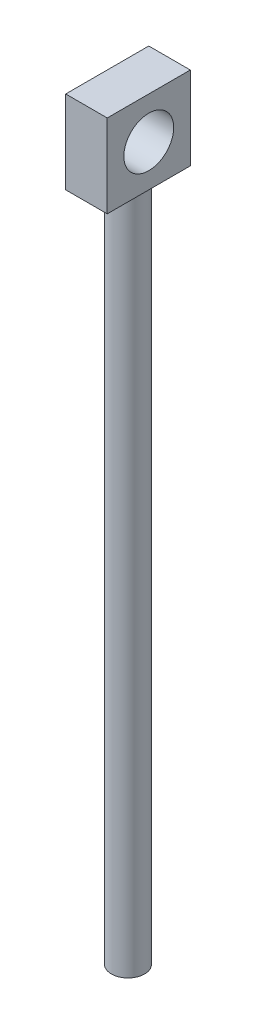
ISO-10303-21;
HEADER;
FILE_DESCRIPTION(('STEP AP214'),'2;1');
FILE_NAME('part.step','',(''),(''),'','','');
FILE_SCHEMA(('AUTOMOTIVE_DESIGN { 1 0 10303 214 1 1 1 1 }'));
ENDSEC;
DATA;
#1=APPLICATION_CONTEXT('core data for automotive mechanical design processes');
#2=APPLICATION_PROTOCOL_DEFINITION('international standard','automotive_design',2000,#1);
#3=PRODUCT_CONTEXT('',#1,'mechanical');
#4=PRODUCT('Part','Part','',(#3));
#5=PRODUCT_RELATED_PRODUCT_CATEGORY('part','',(#4));
#6=PRODUCT_DEFINITION_FORMATION('','',#4);
#7=PRODUCT_DEFINITION_CONTEXT('part definition',#1,'design');
#8=PRODUCT_DEFINITION('design','',#6,#7);
#9=PRODUCT_DEFINITION_SHAPE('','',#8);
#10=(LENGTH_UNIT() NAMED_UNIT(*) SI_UNIT(.MILLI.,.METRE.));
#11=(NAMED_UNIT(*) PLANE_ANGLE_UNIT() SI_UNIT($,.RADIAN.));
#12=(NAMED_UNIT(*) SI_UNIT($,.STERADIAN.) SOLID_ANGLE_UNIT());
#13=UNCERTAINTY_MEASURE_WITH_UNIT(LENGTH_MEASURE(1.E-05),#10,'distance_accuracy_value','');
#14=(GEOMETRIC_REPRESENTATION_CONTEXT(3) GLOBAL_UNCERTAINTY_ASSIGNED_CONTEXT((#13)) GLOBAL_UNIT_ASSIGNED_CONTEXT((#10,
#11,#12)) REPRESENTATION_CONTEXT('',''));
#15=CARTESIAN_POINT('',(0.,0.,0.));
#16=DIRECTION('',(0.,0.,1.));
#17=DIRECTION('',(1.,0.,0.));
#18=AXIS2_PLACEMENT_3D('',#15,#16,#17);
#19=CARTESIAN_POINT('',(0.,60.,0.));
#20=DIRECTION('',(0.,-1.,0.));
#21=DIRECTION('',(0.,0.,-1.));
#22=AXIS2_PLACEMENT_3D('',#19,#20,#21);
#23=CYLINDRICAL_SURFACE('',#22,2.);
#24=CARTESIAN_POINT('',(0.,60.,0.));
#25=DIRECTION('',(0.,1.,0.));
#26=DIRECTION('',(0.,0.,1.));
#27=AXIS2_PLACEMENT_3D('',#24,#25,#26);
#28=CIRCLE('',#27,2.);
#29=CARTESIAN_POINT('',(0.,60.,2.));
#30=VERTEX_POINT('',#29);
#31=EDGE_CURVE('E11',#30,#30,#28,.T.);
#32=ORIENTED_EDGE('',*,*,#31,.F.);
#33=EDGE_LOOP('',(#32));
#34=FACE_BOUND('',#33,.T.);
#35=CARTESIAN_POINT('',(0.,-22.,0.));
#36=DIRECTION('',(0.,-1.,0.));
#37=DIRECTION('',(0.,0.,-1.));
#38=AXIS2_PLACEMENT_3D('',#35,#36,#37);
#39=CIRCLE('',#38,2.);
#40=CARTESIAN_POINT('',(0.,-22.,-2.));
#41=VERTEX_POINT('',#40);
#42=EDGE_CURVE('E121',#41,#41,#39,.T.);
#43=ORIENTED_EDGE('',*,*,#42,.F.);
#44=EDGE_LOOP('',(#43));
#45=FACE_BOUND('',#44,.T.);
#46=ADVANCED_FACE('F49',(#34,#45),#23,.T.);
#47=CARTESIAN_POINT('',(2.5,0.,-5.));
#48=DIRECTION('',(0.,0.,1.));
#49=DIRECTION('',(1.,0.,0.));
#50=AXIS2_PLACEMENT_3D('',#47,#48,#49);
#51=PLANE('',#50);
#52=DIRECTION('',(0.,1.,0.));
#53=VECTOR('',#52,1.);
#54=CARTESIAN_POINT('',(-2.5,0.,-5.));
#55=LINE('',#54,#53);
#56=CARTESIAN_POINT('',(-2.5,60.,-5.));
#57=VERTEX_POINT('',#56);
#58=CARTESIAN_POINT('',(-2.5,70.,-5.));
#59=VERTEX_POINT('',#58);
#60=EDGE_CURVE('E118',#57,#59,#55,.T.);
#61=ORIENTED_EDGE('',*,*,#60,.T.);
#62=DIRECTION('',(-1.,0.,0.));
#63=VECTOR('',#62,1.);
#64=CARTESIAN_POINT('',(2.5,70.,-5.));
#65=LINE('',#64,#63);
#66=CARTESIAN_POINT('',(2.5,70.,-5.));
#67=VERTEX_POINT('',#66);
#68=EDGE_CURVE('E57',#67,#59,#65,.T.);
#69=ORIENTED_EDGE('',*,*,#68,.F.);
#70=DIRECTION('',(0.,1.,0.));
#71=VECTOR('',#70,1.);
#72=CARTESIAN_POINT('',(2.5,0.,-5.));
#73=LINE('',#72,#71);
#74=CARTESIAN_POINT('',(2.5,60.,-5.));
#75=VERTEX_POINT('',#74);
#76=EDGE_CURVE('E89',#75,#67,#73,.T.);
#77=ORIENTED_EDGE('',*,*,#76,.F.);
#78=DIRECTION('',(-1.,0.,0.));
#79=VECTOR('',#78,1.);
#80=CARTESIAN_POINT('',(2.5,60.,-5.));
#81=LINE('',#80,#79);
#82=EDGE_CURVE('E117',#75,#57,#81,.T.);
#83=ORIENTED_EDGE('',*,*,#82,.T.);
#84=EDGE_LOOP('',(#61,#69,#77,#83));
#85=FACE_BOUND('',#84,.T.);
#86=ADVANCED_FACE('F132',(#85),#51,.F.);
#87=CARTESIAN_POINT('',(2.5,70.,0.));
#88=DIRECTION('',(0.,1.,0.));
#89=DIRECTION('',(0.,0.,1.));
#90=AXIS2_PLACEMENT_3D('',#87,#88,#89);
#91=PLANE('',#90);
#92=DIRECTION('',(0.,0.,-1.));
#93=VECTOR('',#92,1.);
#94=CARTESIAN_POINT('',(-2.5,70.,0.));
#95=LINE('',#94,#93);
#96=CARTESIAN_POINT('',(-2.5,70.,5.));
#97=VERTEX_POINT('',#96);
#98=EDGE_CURVE('E99',#97,#59,#95,.T.);
#99=ORIENTED_EDGE('',*,*,#98,.F.);
#100=DIRECTION('',(-1.,0.,0.));
#101=VECTOR('',#100,1.);
#102=CARTESIAN_POINT('',(2.5,70.,5.));
#103=LINE('',#102,#101);
#104=CARTESIAN_POINT('',(2.5,70.,5.));
#105=VERTEX_POINT('',#104);
#106=EDGE_CURVE('E95',#105,#97,#103,.T.);
#107=ORIENTED_EDGE('',*,*,#106,.F.);
#108=DIRECTION('',(0.,0.,-1.));
#109=VECTOR('',#108,1.);
#110=CARTESIAN_POINT('',(2.5,70.,0.));
#111=LINE('',#110,#109);
#112=EDGE_CURVE('E97',#105,#67,#111,.T.);
#113=ORIENTED_EDGE('',*,*,#112,.T.);
#114=ORIENTED_EDGE('',*,*,#68,.T.);
#115=EDGE_LOOP('',(#99,#107,#113,#114));
#116=FACE_BOUND('',#115,.T.);
#117=ADVANCED_FACE('F96',(#116),#91,.T.);
#118=CARTESIAN_POINT('',(2.5,0.,5.));
#119=DIRECTION('',(0.,0.,1.));
#120=DIRECTION('',(1.,0.,0.));
#121=AXIS2_PLACEMENT_3D('',#118,#119,#120);
#122=PLANE('',#121);
#123=DIRECTION('',(0.,1.,0.));
#124=VECTOR('',#123,1.);
#125=CARTESIAN_POINT('',(-2.5,0.,5.));
#126=LINE('',#125,#124);
#127=CARTESIAN_POINT('',(-2.5,60.,5.));
#128=VERTEX_POINT('',#127);
#129=EDGE_CURVE('E123',#128,#97,#126,.T.);
#130=ORIENTED_EDGE('',*,*,#129,.F.);
#131=DIRECTION('',(-1.,0.,0.));
#132=VECTOR('',#131,1.);
#133=CARTESIAN_POINT('',(2.5,60.,5.));
#134=LINE('',#133,#132);
#135=CARTESIAN_POINT('',(2.5,60.,5.));
#136=VERTEX_POINT('',#135);
#137=EDGE_CURVE('E81',#136,#128,#134,.T.);
#138=ORIENTED_EDGE('',*,*,#137,.F.);
#139=DIRECTION('',(0.,1.,0.));
#140=VECTOR('',#139,1.);
#141=CARTESIAN_POINT('',(2.5,0.,5.));
#142=LINE('',#141,#140);
#143=EDGE_CURVE('E107',#136,#105,#142,.T.);
#144=ORIENTED_EDGE('',*,*,#143,.T.);
#145=ORIENTED_EDGE('',*,*,#106,.T.);
#146=EDGE_LOOP('',(#130,#138,#144,#145));
#147=FACE_BOUND('',#146,.T.);
#148=ADVANCED_FACE('F109',(#147),#122,.T.);
#149=CARTESIAN_POINT('',(2.5,60.,0.));
#150=DIRECTION('',(0.,1.,0.));
#151=DIRECTION('',(0.,0.,1.));
#152=AXIS2_PLACEMENT_3D('',#149,#150,#151);
#153=PLANE('',#152);
#154=ORIENTED_EDGE('',*,*,#31,.T.);
#155=EDGE_LOOP('',(#154));
#156=FACE_BOUND('',#155,.T.);
#157=DIRECTION('',(0.,0.,-1.));
#158=VECTOR('',#157,1.);
#159=CARTESIAN_POINT('',(-2.5,60.,0.));
#160=LINE('',#159,#158);
#161=EDGE_CURVE('E84',#128,#57,#160,.T.);
#162=ORIENTED_EDGE('',*,*,#161,.T.);
#163=ORIENTED_EDGE('',*,*,#82,.F.);
#164=DIRECTION('',(0.,0.,-1.));
#165=VECTOR('',#164,1.);
#166=CARTESIAN_POINT('',(2.5,60.,0.));
#167=LINE('',#166,#165);
#168=EDGE_CURVE('E65',#136,#75,#167,.T.);
#169=ORIENTED_EDGE('',*,*,#168,.F.);
#170=ORIENTED_EDGE('',*,*,#137,.T.);
#171=EDGE_LOOP('',(#162,#163,#169,#170));
#172=FACE_BOUND('',#171,.T.);
#173=ADVANCED_FACE('F143',(#156,#172),#153,.F.);
#174=CARTESIAN_POINT('',(2.5,65.,0.));
#175=DIRECTION('',(-1.,0.,0.));
#176=DIRECTION('',(0.,0.,1.));
#177=AXIS2_PLACEMENT_3D('',#174,#175,#176);
#178=CYLINDRICAL_SURFACE('',#177,3.);
#179=CARTESIAN_POINT('',(2.5,65.,0.));
#180=DIRECTION('',(1.,0.,0.));
#181=DIRECTION('',(0.,0.,-1.));
#182=AXIS2_PLACEMENT_3D('',#179,#180,#181);
#183=CIRCLE('',#182,3.);
#184=CARTESIAN_POINT('',(2.5,65.,-3.));
#185=VERTEX_POINT('',#184);
#186=EDGE_CURVE('E111',#185,#185,#183,.T.);
#187=ORIENTED_EDGE('',*,*,#186,.T.);
#188=EDGE_LOOP('',(#187));
#189=FACE_BOUND('',#188,.T.);
#190=CARTESIAN_POINT('',(-2.5,65.,0.));
#191=DIRECTION('',(1.,0.,0.));
#192=DIRECTION('',(0.,0.,-1.));
#193=AXIS2_PLACEMENT_3D('',#190,#191,#192);
#194=CIRCLE('',#193,3.);
#195=CARTESIAN_POINT('',(-2.5,65.,-3.));
#196=VERTEX_POINT('',#195);
#197=EDGE_CURVE('E126',#196,#196,#194,.T.);
#198=ORIENTED_EDGE('',*,*,#197,.F.);
#199=EDGE_LOOP('',(#198));
#200=FACE_BOUND('',#199,.T.);
#201=ADVANCED_FACE('F141',(#189,#200),#178,.F.);
#202=CARTESIAN_POINT('',(2.5,0.,0.));
#203=DIRECTION('',(1.,0.,0.));
#204=DIRECTION('',(0.,0.,-1.));
#205=AXIS2_PLACEMENT_3D('',#202,#203,#204);
#206=PLANE('',#205);
#207=ORIENTED_EDGE('',*,*,#76,.T.);
#208=ORIENTED_EDGE('',*,*,#112,.F.);
#209=ORIENTED_EDGE('',*,*,#143,.F.);
#210=ORIENTED_EDGE('',*,*,#168,.T.);
#211=EDGE_LOOP('',(#207,#208,#209,#210));
#212=FACE_BOUND('',#211,.T.);
#213=ORIENTED_EDGE('',*,*,#186,.F.);
#214=EDGE_LOOP('',(#213));
#215=FACE_BOUND('',#214,.T.);
#216=ADVANCED_FACE('F105',(#212,#215),#206,.T.);
#217=CARTESIAN_POINT('',(-2.5,0.,0.));
#218=DIRECTION('',(1.,0.,0.));
#219=DIRECTION('',(0.,0.,-1.));
#220=AXIS2_PLACEMENT_3D('',#217,#218,#219);
#221=PLANE('',#220);
#222=ORIENTED_EDGE('',*,*,#60,.F.);
#223=ORIENTED_EDGE('',*,*,#161,.F.);
#224=ORIENTED_EDGE('',*,*,#129,.T.);
#225=ORIENTED_EDGE('',*,*,#98,.T.);
#226=EDGE_LOOP('',(#222,#223,#224,#225));
#227=FACE_BOUND('',#226,.T.);
#228=ORIENTED_EDGE('',*,*,#197,.T.);
#229=EDGE_LOOP('',(#228));
#230=FACE_BOUND('',#229,.T.);
#231=ADVANCED_FACE('F134',(#227,#230),#221,.F.);
#232=CARTESIAN_POINT('',(0.,-22.,0.));
#233=DIRECTION('',(0.,-1.,0.));
#234=DIRECTION('',(0.,0.,-1.));
#235=AXIS2_PLACEMENT_3D('',#232,#233,#234);
#236=PLANE('',#235);
#237=ORIENTED_EDGE('',*,*,#42,.T.);
#238=EDGE_LOOP('',(#237));
#239=FACE_BOUND('',#238,.T.);
#240=ADVANCED_FACE('F137',(#239),#236,.T.);
#241=CLOSED_SHELL('',(#46,#86,#117,#148,#173,#201,#216,#231,#240));
#242=MANIFOLD_SOLID_BREP('B2',#241);
#243=ADVANCED_BREP_SHAPE_REPRESENTATION('',(#18,#242),#14);
#244=SHAPE_DEFINITION_REPRESENTATION(#9,#243);
ENDSEC;
END-ISO-10303-21;
